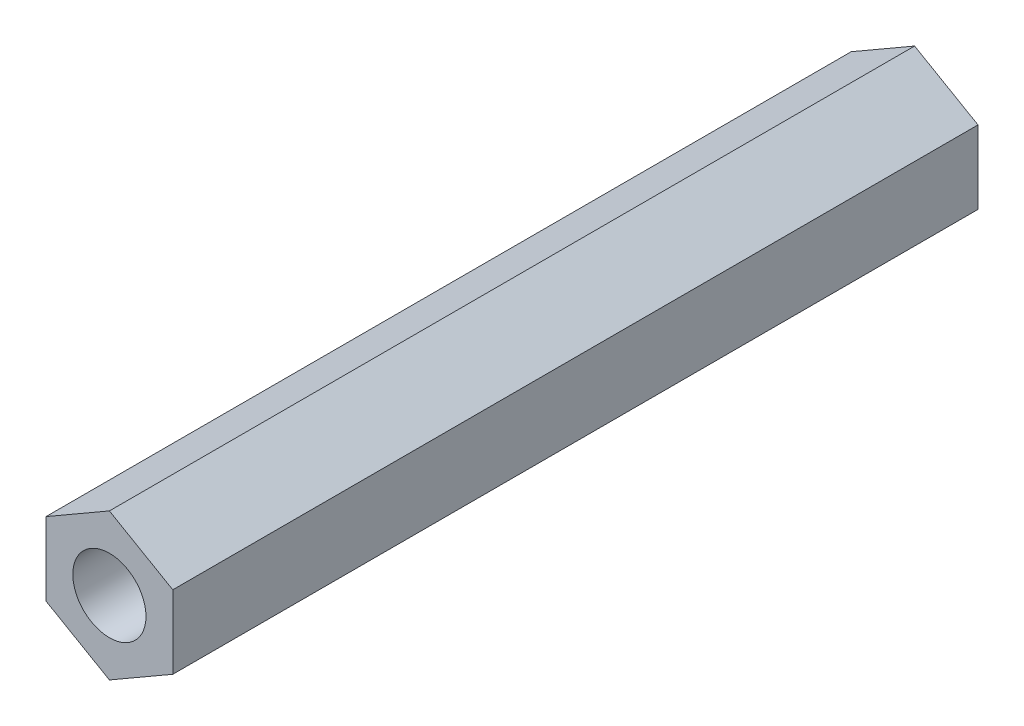
ISO-10303-21;
HEADER;
FILE_DESCRIPTION(('STEP AP214'),'2;1');
FILE_NAME('part.step','',(''),(''),'','','');
FILE_SCHEMA(('AUTOMOTIVE_DESIGN { 1 0 10303 214 1 1 1 1 }'));
ENDSEC;
DATA;
#1=APPLICATION_CONTEXT('core data for automotive mechanical design processes');
#2=APPLICATION_PROTOCOL_DEFINITION('international standard','automotive_design',2000,#1);
#3=PRODUCT_CONTEXT('',#1,'mechanical');
#4=PRODUCT('Part','Part','',(#3));
#5=PRODUCT_RELATED_PRODUCT_CATEGORY('part','',(#4));
#6=PRODUCT_DEFINITION_FORMATION('','',#4);
#7=PRODUCT_DEFINITION_CONTEXT('part definition',#1,'design');
#8=PRODUCT_DEFINITION('design','',#6,#7);
#9=PRODUCT_DEFINITION_SHAPE('','',#8);
#10=(LENGTH_UNIT() NAMED_UNIT(*) SI_UNIT(.MILLI.,.METRE.));
#11=(NAMED_UNIT(*) PLANE_ANGLE_UNIT() SI_UNIT($,.RADIAN.));
#12=(NAMED_UNIT(*) SI_UNIT($,.STERADIAN.) SOLID_ANGLE_UNIT());
#13=UNCERTAINTY_MEASURE_WITH_UNIT(LENGTH_MEASURE(1.E-05),#10,'distance_accuracy_value','');
#14=(GEOMETRIC_REPRESENTATION_CONTEXT(3) GLOBAL_UNCERTAINTY_ASSIGNED_CONTEXT((#13)) GLOBAL_UNIT_ASSIGNED_CONTEXT((#10,
#11,#12)) REPRESENTATION_CONTEXT('',''));
#15=CARTESIAN_POINT('',(0.,0.,0.));
#16=DIRECTION('',(0.,0.,1.));
#17=DIRECTION('',(1.,0.,0.));
#18=AXIS2_PLACEMENT_3D('',#15,#16,#17);
#19=CARTESIAN_POINT('',(0.433012701892216,0.250000000000005,5.5));
#20=DIRECTION('',(-0.499999999999995,-0.866025403784442,0.));
#21=DIRECTION('',(0.866025403784441,-0.499999999999995,0.));
#22=AXIS2_PLACEMENT_3D('',#19,#20,#21);
#23=PLANE('',#22);
#24=DIRECTION('',(-0.866025403784442,0.499999999999995,0.));
#25=VECTOR('',#24,1.);
#26=CARTESIAN_POINT('',(0.433012701892216,0.250000000000005,0.));
#27=LINE('',#26,#25);
#28=CARTESIAN_POINT('',(0.433012701892216,0.250000000000005,0.));
#29=VERTEX_POINT('',#28);
#30=CARTESIAN_POINT('',(0.,0.5,0.));
#31=VERTEX_POINT('',#30);
#32=EDGE_CURVE('E119',#29,#31,#27,.T.);
#33=ORIENTED_EDGE('',*,*,#32,.T.);
#34=DIRECTION('',(0.,0.,-1.));
#35=VECTOR('',#34,1.);
#36=CARTESIAN_POINT('',(0.,0.5,5.5));
#37=LINE('',#36,#35);
#38=CARTESIAN_POINT('',(0.,0.5,5.5));
#39=VERTEX_POINT('',#38);
#40=EDGE_CURVE('E11',#39,#31,#37,.T.);
#41=ORIENTED_EDGE('',*,*,#40,.F.);
#42=DIRECTION('',(-0.866025403784442,0.499999999999995,0.));
#43=VECTOR('',#42,1.);
#44=CARTESIAN_POINT('',(0.433012701892216,0.250000000000005,5.5));
#45=LINE('',#44,#43);
#46=CARTESIAN_POINT('',(0.433012701892216,0.250000000000005,5.5));
#47=VERTEX_POINT('',#46);
#48=EDGE_CURVE('E130',#47,#39,#45,.T.);
#49=ORIENTED_EDGE('',*,*,#48,.F.);
#50=DIRECTION('',(0.,0.,-1.));
#51=VECTOR('',#50,1.);
#52=CARTESIAN_POINT('',(0.433012701892216,0.250000000000005,5.5));
#53=LINE('',#52,#51);
#54=EDGE_CURVE('E115',#47,#29,#53,.T.);
#55=ORIENTED_EDGE('',*,*,#54,.T.);
#56=EDGE_LOOP('',(#33,#41,#49,#55));
#57=FACE_BOUND('',#56,.T.);
#58=ADVANCED_FACE('F35',(#57),#23,.F.);
#59=CARTESIAN_POINT('',(0.,0.5,5.5));
#60=DIRECTION('',(0.500000000000001,-0.866025403784438,0.));
#61=DIRECTION('',(0.866025403784438,0.500000000000001,0.));
#62=AXIS2_PLACEMENT_3D('',#59,#60,#61);
#63=PLANE('',#62);
#64=DIRECTION('',(-0.866025403784438,-0.500000000000001,0.));
#65=VECTOR('',#64,1.);
#66=CARTESIAN_POINT('',(0.,0.5,0.));
#67=LINE('',#66,#65);
#68=CARTESIAN_POINT('',(-0.43301270189222,0.249999999999999,0.));
#69=VERTEX_POINT('',#68);
#70=EDGE_CURVE('E122',#31,#69,#67,.T.);
#71=ORIENTED_EDGE('',*,*,#70,.T.);
#72=DIRECTION('',(0.,0.,-1.));
#73=VECTOR('',#72,1.);
#74=CARTESIAN_POINT('',(-0.43301270189222,0.249999999999999,5.5));
#75=LINE('',#74,#73);
#76=CARTESIAN_POINT('',(-0.43301270189222,0.249999999999999,5.5));
#77=VERTEX_POINT('',#76);
#78=EDGE_CURVE('E43',#77,#69,#75,.T.);
#79=ORIENTED_EDGE('',*,*,#78,.F.);
#80=DIRECTION('',(-0.866025403784438,-0.500000000000001,0.));
#81=VECTOR('',#80,1.);
#82=CARTESIAN_POINT('',(0.,0.5,5.5));
#83=LINE('',#82,#81);
#84=EDGE_CURVE('E88',#39,#77,#83,.T.);
#85=ORIENTED_EDGE('',*,*,#84,.F.);
#86=ORIENTED_EDGE('',*,*,#40,.T.);
#87=EDGE_LOOP('',(#71,#79,#85,#86));
#88=FACE_BOUND('',#87,.T.);
#89=ADVANCED_FACE('F155',(#88),#63,.F.);
#90=CARTESIAN_POINT('',(-0.43301270189222,0.249999999999999,5.5));
#91=DIRECTION('',(1.,0.,0.));
#92=DIRECTION('',(0.,1.,0.));
#93=AXIS2_PLACEMENT_3D('',#90,#91,#92);
#94=PLANE('',#93);
#95=DIRECTION('',(0.,-1.,0.));
#96=VECTOR('',#95,1.);
#97=CARTESIAN_POINT('',(-0.43301270189222,0.249999999999999,0.));
#98=LINE('',#97,#96);
#99=CARTESIAN_POINT('',(-0.433012701892218,-0.250000000000002,0.));
#100=VERTEX_POINT('',#99);
#101=EDGE_CURVE('E125',#69,#100,#98,.T.);
#102=ORIENTED_EDGE('',*,*,#101,.T.);
#103=DIRECTION('',(0.,0.,-1.));
#104=VECTOR('',#103,1.);
#105=CARTESIAN_POINT('',(-0.433012701892218,-0.250000000000002,5.5));
#106=LINE('',#105,#104);
#107=CARTESIAN_POINT('',(-0.433012701892218,-0.250000000000002,5.5));
#108=VERTEX_POINT('',#107);
#109=EDGE_CURVE('E110',#108,#100,#106,.T.);
#110=ORIENTED_EDGE('',*,*,#109,.F.);
#111=DIRECTION('',(0.,-1.,0.));
#112=VECTOR('',#111,1.);
#113=CARTESIAN_POINT('',(-0.43301270189222,0.249999999999999,5.5));
#114=LINE('',#113,#112);
#115=EDGE_CURVE('E101',#77,#108,#114,.T.);
#116=ORIENTED_EDGE('',*,*,#115,.F.);
#117=ORIENTED_EDGE('',*,*,#78,.T.);
#118=EDGE_LOOP('',(#102,#110,#116,#117));
#119=FACE_BOUND('',#118,.T.);
#120=ADVANCED_FACE('F136',(#119),#94,.F.);
#121=CARTESIAN_POINT('',(-0.433012701892218,-0.250000000000002,5.5));
#122=DIRECTION('',(0.499999999999995,0.866025403784442,0.));
#123=DIRECTION('',(-0.866025403784441,0.499999999999995,0.));
#124=AXIS2_PLACEMENT_3D('',#121,#122,#123);
#125=PLANE('',#124);
#126=DIRECTION('',(0.866025403784442,-0.499999999999995,0.));
#127=VECTOR('',#126,1.);
#128=CARTESIAN_POINT('',(-0.433012701892218,-0.250000000000002,0.));
#129=LINE('',#128,#127);
#130=CARTESIAN_POINT('',(0.,-0.5,0.));
#131=VERTEX_POINT('',#130);
#132=EDGE_CURVE('E109',#100,#131,#129,.T.);
#133=ORIENTED_EDGE('',*,*,#132,.T.);
#134=DIRECTION('',(0.,0.,-1.));
#135=VECTOR('',#134,1.);
#136=CARTESIAN_POINT('',(0.,-0.5,5.5));
#137=LINE('',#136,#135);
#138=CARTESIAN_POINT('',(0.,-0.5,5.5));
#139=VERTEX_POINT('',#138);
#140=EDGE_CURVE('E106',#139,#131,#137,.T.);
#141=ORIENTED_EDGE('',*,*,#140,.F.);
#142=DIRECTION('',(0.866025403784442,-0.499999999999995,0.));
#143=VECTOR('',#142,1.);
#144=CARTESIAN_POINT('',(-0.433012701892218,-0.250000000000002,5.5));
#145=LINE('',#144,#143);
#146=EDGE_CURVE('E95',#108,#139,#145,.T.);
#147=ORIENTED_EDGE('',*,*,#146,.F.);
#148=ORIENTED_EDGE('',*,*,#109,.T.);
#149=EDGE_LOOP('',(#133,#141,#147,#148));
#150=FACE_BOUND('',#149,.T.);
#151=ADVANCED_FACE('F107',(#150),#125,.F.);
#152=CARTESIAN_POINT('',(0.,-0.5,5.5));
#153=DIRECTION('',(-0.500000000000007,0.866025403784435,0.));
#154=DIRECTION('',(-0.866025403784435,-0.500000000000007,0.));
#155=AXIS2_PLACEMENT_3D('',#152,#153,#154);
#156=PLANE('',#155);
#157=DIRECTION('',(0.866025403784434,0.500000000000007,0.));
#158=VECTOR('',#157,1.);
#159=CARTESIAN_POINT('',(0.,-0.5,0.));
#160=LINE('',#159,#158);
#161=CARTESIAN_POINT('',(0.433012701892222,-0.249999999999996,0.));
#162=VERTEX_POINT('',#161);
#163=EDGE_CURVE('E74',#131,#162,#160,.T.);
#164=ORIENTED_EDGE('',*,*,#163,.T.);
#165=DIRECTION('',(0.,0.,-1.));
#166=VECTOR('',#165,1.);
#167=CARTESIAN_POINT('',(0.433012701892222,-0.249999999999996,5.5));
#168=LINE('',#167,#166);
#169=CARTESIAN_POINT('',(0.433012701892222,-0.249999999999996,5.5));
#170=VERTEX_POINT('',#169);
#171=EDGE_CURVE('E111',#170,#162,#168,.T.);
#172=ORIENTED_EDGE('',*,*,#171,.F.);
#173=DIRECTION('',(0.866025403784434,0.500000000000007,0.));
#174=VECTOR('',#173,1.);
#175=CARTESIAN_POINT('',(0.,-0.5,5.5));
#176=LINE('',#175,#174);
#177=EDGE_CURVE('E99',#139,#170,#176,.T.);
#178=ORIENTED_EDGE('',*,*,#177,.F.);
#179=ORIENTED_EDGE('',*,*,#140,.T.);
#180=EDGE_LOOP('',(#164,#172,#178,#179));
#181=FACE_BOUND('',#180,.T.);
#182=ADVANCED_FACE('F113',(#181),#156,.F.);
#183=CARTESIAN_POINT('',(0.433012701892222,-0.249999999999996,5.5));
#184=DIRECTION('',(-1.,0.,0.));
#185=DIRECTION('',(0.,-1.,0.));
#186=AXIS2_PLACEMENT_3D('',#183,#184,#185);
#187=PLANE('',#186);
#188=DIRECTION('',(0.,1.,0.));
#189=VECTOR('',#188,1.);
#190=CARTESIAN_POINT('',(0.433012701892222,-0.249999999999996,0.));
#191=LINE('',#190,#189);
#192=EDGE_CURVE('E80',#162,#29,#191,.T.);
#193=ORIENTED_EDGE('',*,*,#192,.T.);
#194=ORIENTED_EDGE('',*,*,#54,.F.);
#195=DIRECTION('',(0.,1.,0.));
#196=VECTOR('',#195,1.);
#197=CARTESIAN_POINT('',(0.433012701892222,-0.249999999999996,5.5));
#198=LINE('',#197,#196);
#199=EDGE_CURVE('E51',#170,#47,#198,.T.);
#200=ORIENTED_EDGE('',*,*,#199,.F.);
#201=ORIENTED_EDGE('',*,*,#171,.T.);
#202=EDGE_LOOP('',(#193,#194,#200,#201));
#203=FACE_BOUND('',#202,.T.);
#204=ADVANCED_FACE('F143',(#203),#187,.F.);
#205=CARTESIAN_POINT('',(0.,0.,5.5));
#206=DIRECTION('',(0.,0.,1.));
#207=DIRECTION('',(1.,0.,0.));
#208=AXIS2_PLACEMENT_3D('',#205,#206,#207);
#209=PLANE('',#208);
#210=CARTESIAN_POINT('',(0.,0.,5.5));
#211=DIRECTION('',(0.,0.,1.));
#212=DIRECTION('',(1.,0.,0.));
#213=AXIS2_PLACEMENT_3D('',#210,#211,#212);
#214=CIRCLE('',#213,0.25);
#215=CARTESIAN_POINT('',(0.25,0.,5.5));
#216=VERTEX_POINT('',#215);
#217=EDGE_CURVE('E210',#216,#216,#214,.T.);
#218=ORIENTED_EDGE('',*,*,#217,.F.);
#219=EDGE_LOOP('',(#218));
#220=FACE_BOUND('',#219,.T.);
#221=ORIENTED_EDGE('',*,*,#48,.T.);
#222=ORIENTED_EDGE('',*,*,#84,.T.);
#223=ORIENTED_EDGE('',*,*,#115,.T.);
#224=ORIENTED_EDGE('',*,*,#146,.T.);
#225=ORIENTED_EDGE('',*,*,#177,.T.);
#226=ORIENTED_EDGE('',*,*,#199,.T.);
#227=EDGE_LOOP('',(#221,#222,#223,#224,#225,#226));
#228=FACE_BOUND('',#227,.T.);
#229=ADVANCED_FACE('F97',(#220,#228),#209,.T.);
#230=CARTESIAN_POINT('',(0.,0.,0.));
#231=DIRECTION('',(0.,0.,1.));
#232=DIRECTION('',(1.,0.,0.));
#233=AXIS2_PLACEMENT_3D('',#230,#231,#232);
#234=PLANE('',#233);
#235=CARTESIAN_POINT('',(0.,0.,0.));
#236=DIRECTION('',(0.,0.,1.));
#237=DIRECTION('',(1.,0.,0.));
#238=AXIS2_PLACEMENT_3D('',#235,#236,#237);
#239=CIRCLE('',#238,0.25);
#240=CARTESIAN_POINT('',(0.25,0.,0.));
#241=VERTEX_POINT('',#240);
#242=EDGE_CURVE('E123',#241,#241,#239,.T.);
#243=ORIENTED_EDGE('',*,*,#242,.T.);
#244=EDGE_LOOP('',(#243));
#245=FACE_BOUND('',#244,.T.);
#246=ORIENTED_EDGE('',*,*,#32,.F.);
#247=ORIENTED_EDGE('',*,*,#192,.F.);
#248=ORIENTED_EDGE('',*,*,#163,.F.);
#249=ORIENTED_EDGE('',*,*,#132,.F.);
#250=ORIENTED_EDGE('',*,*,#101,.F.);
#251=ORIENTED_EDGE('',*,*,#70,.F.);
#252=EDGE_LOOP('',(#246,#247,#248,#249,#250,#251));
#253=FACE_BOUND('',#252,.T.);
#254=ADVANCED_FACE('F139',(#245,#253),#234,.F.);
#255=CARTESIAN_POINT('',(0.,0.,0.));
#256=DIRECTION('',(0.,0.,1.));
#257=DIRECTION('',(1.,0.,0.));
#258=AXIS2_PLACEMENT_3D('',#255,#256,#257);
#259=CYLINDRICAL_SURFACE('',#258,0.25);
#260=ORIENTED_EDGE('',*,*,#242,.F.);
#261=EDGE_LOOP('',(#260));
#262=FACE_BOUND('',#261,.T.);
#263=ORIENTED_EDGE('',*,*,#217,.T.);
#264=EDGE_LOOP('',(#263));
#265=FACE_BOUND('',#264,.T.);
#266=ADVANCED_FACE('F192',(#262,#265),#259,.F.);
#267=CLOSED_SHELL('',(#58,#89,#120,#151,#182,#204,#229,#254,#266));
#268=MANIFOLD_SOLID_BREP('B2',#267);
#269=ADVANCED_BREP_SHAPE_REPRESENTATION('',(#18,#268),#14);
#270=SHAPE_DEFINITION_REPRESENTATION(#9,#269);
ENDSEC;
END-ISO-10303-21;
